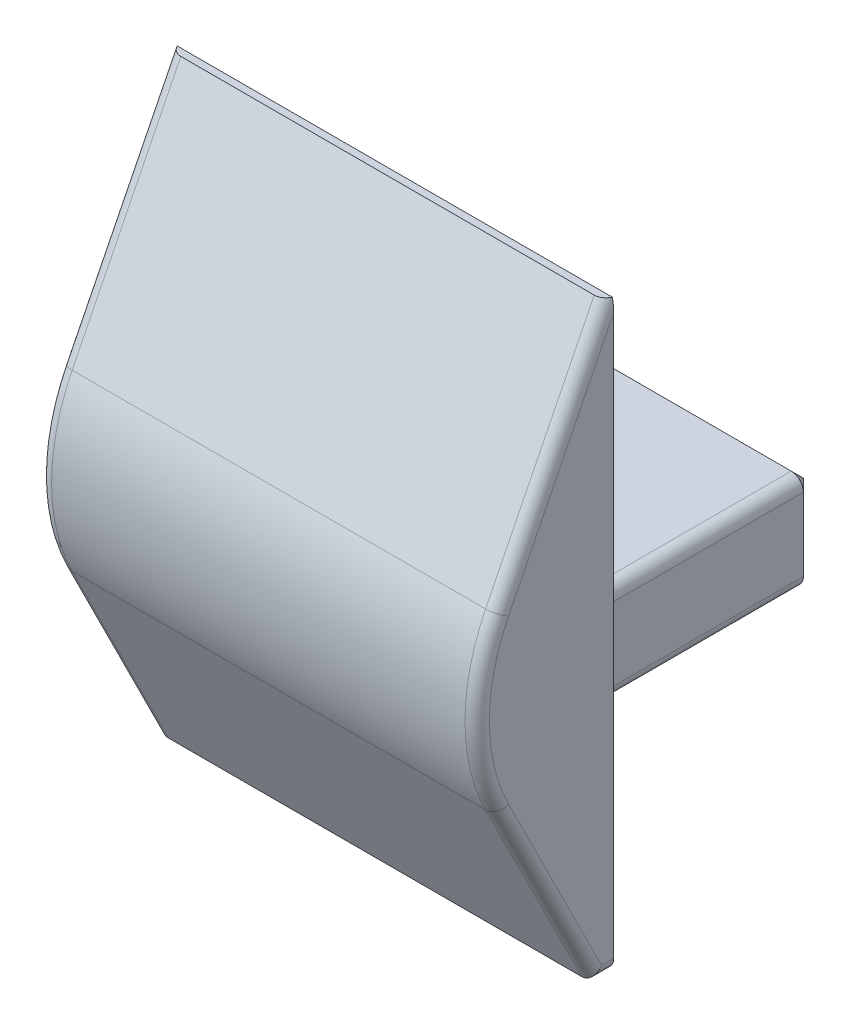
ISO-10303-21;
HEADER;
FILE_DESCRIPTION(('STEP AP214'),'2;1');
FILE_NAME('part.step','',(''),(''),'','','');
FILE_SCHEMA(('AUTOMOTIVE_DESIGN { 1 0 10303 214 1 1 1 1 }'));
ENDSEC;
DATA;
#1=APPLICATION_CONTEXT('core data for automotive mechanical design processes');
#2=APPLICATION_PROTOCOL_DEFINITION('international standard','automotive_design',2000,#1);
#3=PRODUCT_CONTEXT('',#1,'mechanical');
#4=PRODUCT('Part','Part','',(#3));
#5=PRODUCT_RELATED_PRODUCT_CATEGORY('part','',(#4));
#6=PRODUCT_DEFINITION_FORMATION('','',#4);
#7=PRODUCT_DEFINITION_CONTEXT('part definition',#1,'design');
#8=PRODUCT_DEFINITION('design','',#6,#7);
#9=PRODUCT_DEFINITION_SHAPE('','',#8);
#10=(LENGTH_UNIT() NAMED_UNIT(*) SI_UNIT(.MILLI.,.METRE.));
#11=(NAMED_UNIT(*) PLANE_ANGLE_UNIT() SI_UNIT($,.RADIAN.));
#12=(NAMED_UNIT(*) SI_UNIT($,.STERADIAN.) SOLID_ANGLE_UNIT());
#13=UNCERTAINTY_MEASURE_WITH_UNIT(LENGTH_MEASURE(1.E-05),#10,'distance_accuracy_value','');
#14=(GEOMETRIC_REPRESENTATION_CONTEXT(3) GLOBAL_UNCERTAINTY_ASSIGNED_CONTEXT((#13)) GLOBAL_UNIT_ASSIGNED_CONTEXT((#10,
#11,#12)) REPRESENTATION_CONTEXT('',''));
#15=CARTESIAN_POINT('',(0.,0.,0.));
#16=DIRECTION('',(0.,0.,1.));
#17=DIRECTION('',(1.,0.,0.));
#18=AXIS2_PLACEMENT_3D('',#15,#16,#17);
#19=CARTESIAN_POINT('',(60.6049457563615,0.,28.7935567964383));
#20=DIRECTION('',(0.,0.,1.));
#21=DIRECTION('',(0.,-1.,0.));
#22=AXIS2_PLACEMENT_3D('',#19,#20,#21);
#23=PLANE('',#22);
#24=DIRECTION('',(-1.,0.,0.));
#25=VECTOR('',#24,1.);
#26=CARTESIAN_POINT('',(60.6049457563615,-853.619201363697,28.7935567964377));
#27=LINE('',#26,#25);
#28=CARTESIAN_POINT('',(34.8831606908635,-853.619201363697,28.7935567964377));
#29=VERTEX_POINT('',#28);
#30=CARTESIAN_POINT('',(16.996982024228,-853.619201363697,28.7935567964377));
#31=VERTEX_POINT('',#30);
#32=EDGE_CURVE('E378',#29,#31,#27,.T.);
#33=ORIENTED_EDGE('',*,*,#32,.F.);
#34=CARTESIAN_POINT('',(34.4400713575457,-854.137235352447,28.7935567964377));
#35=DIRECTION('',(0.,0.,1.));
#36=DIRECTION('',(0.,1.,0.));
#37=AXIS2_PLACEMENT_3D('',#34,#35,#36);
#38=ELLIPSE('',#37,1.1180339887498,0.5);
#39=CARTESIAN_POINT('',(34.9400713575457,-854.137235352447,28.7935567964377));
#40=VERTEX_POINT('',#39);
#41=EDGE_CURVE('E213',#29,#40,#38,.F.);
#42=ORIENTED_EDGE('',*,*,#41,.T.);
#43=DIRECTION('',(0.,1.,0.));
#44=VECTOR('',#43,1.);
#45=CARTESIAN_POINT('',(34.9400713575457,0.,28.7935567964383));
#46=LINE('',#45,#44);
#47=CARTESIAN_POINT('',(34.9400713575457,-877.136577571572,28.7935567964377));
#48=VERTEX_POINT('',#47);
#49=EDGE_CURVE('E197',#48,#40,#46,.T.);
#50=ORIENTED_EDGE('',*,*,#49,.F.);
#51=CARTESIAN_POINT('',(34.4400713575457,-877.136577571572,28.7935567964377));
#52=DIRECTION('',(0.,0.,1.));
#53=DIRECTION('',(0.,-1.,0.));
#54=AXIS2_PLACEMENT_3D('',#51,#52,#53);
#55=CIRCLE('',#54,0.5);
#56=CARTESIAN_POINT('',(34.4400713575457,-877.636577571572,28.7935567964377));
#57=VERTEX_POINT('',#56);
#58=EDGE_CURVE('E210',#48,#57,#55,.F.);
#59=ORIENTED_EDGE('',*,*,#58,.T.);
#60=DIRECTION('',(-1.,0.,0.));
#61=VECTOR('',#60,1.);
#62=CARTESIAN_POINT('',(60.6049457563615,-877.636577571572,28.7935567964377));
#63=LINE('',#62,#61);
#64=CARTESIAN_POINT('',(17.4400713575457,-877.636577571572,28.7935567964377));
#65=VERTEX_POINT('',#64);
#66=EDGE_CURVE('E376',#57,#65,#63,.T.);
#67=ORIENTED_EDGE('',*,*,#66,.T.);
#68=CARTESIAN_POINT('',(17.4400713575457,-877.136577571572,28.7935567964377));
#69=DIRECTION('',(0.,0.,1.));
#70=DIRECTION('',(0.,-1.,0.));
#71=AXIS2_PLACEMENT_3D('',#68,#69,#70);
#72=CIRCLE('',#71,0.5);
#73=CARTESIAN_POINT('',(16.9400713575457,-877.136577571572,28.7935567964377));
#74=VERTEX_POINT('',#73);
#75=EDGE_CURVE('E219',#65,#74,#72,.F.);
#76=ORIENTED_EDGE('',*,*,#75,.T.);
#77=DIRECTION('',(0.,-1.,0.));
#78=VECTOR('',#77,1.);
#79=CARTESIAN_POINT('',(16.9400713575457,0.,28.7935567964383));
#80=LINE('',#79,#78);
#81=CARTESIAN_POINT('',(16.9400713575457,-854.137235352447,28.7935567964377));
#82=VERTEX_POINT('',#81);
#83=EDGE_CURVE('E366',#82,#74,#80,.T.);
#84=ORIENTED_EDGE('',*,*,#83,.F.);
#85=CARTESIAN_POINT('',(17.4400713575457,-854.137235352447,28.7935567964377));
#86=DIRECTION('',(0.,0.,1.));
#87=DIRECTION('',(0.,1.,0.));
#88=AXIS2_PLACEMENT_3D('',#85,#86,#87);
#89=ELLIPSE('',#88,1.1180339887498,0.5);
#90=EDGE_CURVE('E222',#82,#31,#89,.F.);
#91=ORIENTED_EDGE('',*,*,#90,.T.);
#92=EDGE_LOOP('',(#33,#42,#50,#59,#67,#76,#84,#91));
#93=FACE_BOUND('',#92,.T.);
#94=DIRECTION('',(0.,-1.,0.));
#95=VECTOR('',#94,1.);
#96=CARTESIAN_POINT('',(34.7400713575457,0.,28.7935567964383));
#97=LINE('',#96,#95);
#98=CARTESIAN_POINT('',(34.7400713575457,-864.636577571572,28.7935567964377));
#99=VERTEX_POINT('',#98);
#100=CARTESIAN_POINT('',(34.7400713575457,-867.636577571572,28.7935567964377));
#101=VERTEX_POINT('',#100);
#102=EDGE_CURVE('E360',#99,#101,#97,.T.);
#103=ORIENTED_EDGE('',*,*,#102,.F.);
#104=CARTESIAN_POINT('',(34.2400713575457,-864.636577571572,28.7935567964377));
#105=DIRECTION('',(0.,0.,1.));
#106=DIRECTION('',(0.,-1.,0.));
#107=AXIS2_PLACEMENT_3D('',#104,#105,#106);
#108=CIRCLE('',#107,0.5);
#109=CARTESIAN_POINT('',(34.2400713575457,-864.136577571572,28.7935567964377));
#110=VERTEX_POINT('',#109);
#111=EDGE_CURVE('E275',#99,#110,#108,.T.);
#112=ORIENTED_EDGE('',*,*,#111,.T.);
#113=DIRECTION('',(-1.,0.,0.));
#114=VECTOR('',#113,1.);
#115=CARTESIAN_POINT('',(44.2342184715733,-864.136577571572,28.7935567964377));
#116=LINE('',#115,#114);
#117=CARTESIAN_POINT('',(17.6400713575457,-864.136577571572,28.7935567964377));
#118=VERTEX_POINT('',#117);
#119=EDGE_CURVE('E357',#110,#118,#116,.T.);
#120=ORIENTED_EDGE('',*,*,#119,.T.);
#121=CARTESIAN_POINT('',(17.6400713575457,-864.636577571572,28.7935567964377));
#122=DIRECTION('',(0.,0.,1.));
#123=DIRECTION('',(0.,-1.,0.));
#124=AXIS2_PLACEMENT_3D('',#121,#122,#123);
#125=CIRCLE('',#124,0.5);
#126=CARTESIAN_POINT('',(17.1400713575457,-864.636577571572,28.7935567964377));
#127=VERTEX_POINT('',#126);
#128=EDGE_CURVE('E271',#118,#127,#125,.T.);
#129=ORIENTED_EDGE('',*,*,#128,.T.);
#130=DIRECTION('',(0.,-1.,0.));
#131=VECTOR('',#130,1.);
#132=CARTESIAN_POINT('',(17.1400713575457,0.,28.7935567964383));
#133=LINE('',#132,#131);
#134=CARTESIAN_POINT('',(17.1400713575457,-867.636577571572,28.7935567964377));
#135=VERTEX_POINT('',#134);
#136=EDGE_CURVE('E286',#127,#135,#133,.T.);
#137=ORIENTED_EDGE('',*,*,#136,.T.);
#138=CARTESIAN_POINT('',(17.6400713575457,-867.636577571572,28.7935567964377));
#139=DIRECTION('',(0.,0.,1.));
#140=DIRECTION('',(0.,-1.,0.));
#141=AXIS2_PLACEMENT_3D('',#138,#139,#140);
#142=CIRCLE('',#141,0.5);
#143=CARTESIAN_POINT('',(17.6400713575457,-868.136577571572,28.7935567964377));
#144=VERTEX_POINT('',#143);
#145=EDGE_CURVE('E269',#135,#144,#142,.T.);
#146=ORIENTED_EDGE('',*,*,#145,.T.);
#147=DIRECTION('',(-1.,0.,0.));
#148=VECTOR('',#147,1.);
#149=CARTESIAN_POINT('',(44.2342184715733,-868.136577571572,28.7935567964377));
#150=LINE('',#149,#148);
#151=CARTESIAN_POINT('',(34.2400713575457,-868.136577571572,28.7935567964377));
#152=VERTEX_POINT('',#151);
#153=EDGE_CURVE('E355',#152,#144,#150,.T.);
#154=ORIENTED_EDGE('',*,*,#153,.F.);
#155=CARTESIAN_POINT('',(34.2400713575457,-867.636577571572,28.7935567964377));
#156=DIRECTION('',(0.,0.,1.));
#157=DIRECTION('',(0.,-1.,0.));
#158=AXIS2_PLACEMENT_3D('',#155,#156,#157);
#159=CIRCLE('',#158,0.5);
#160=EDGE_CURVE('E273',#152,#101,#159,.T.);
#161=ORIENTED_EDGE('',*,*,#160,.T.);
#162=EDGE_LOOP('',(#103,#112,#120,#129,#137,#146,#154,#161));
#163=FACE_BOUND('',#162,.T.);
#164=ADVANCED_FACE('F47',(#93,#163),#23,.F.);
#165=CARTESIAN_POINT('',(60.6049457563615,-866.136577571572,26.4079729903764));
#166=DIRECTION('',(-1.,0.,0.));
#167=DIRECTION('',(0.,0.,1.));
#168=AXIS2_PLACEMENT_3D('',#165,#166,#167);
#169=CYLINDRICAL_SURFACE('',#168,8.00000000000002);
#170=DIRECTION('',(-1.,0.,0.));
#171=VECTOR('',#170,1.);
#172=CARTESIAN_POINT('',(60.6049457563615,-869.714286335572,33.5633905183756));
#173=LINE('',#172,#171);
#174=CARTESIAN_POINT('',(34.4400713575457,-869.714286335572,33.5633905183756));
#175=VERTEX_POINT('',#174);
#176=CARTESIAN_POINT('',(17.4400713575457,-869.714286335572,33.5633905183756));
#177=VERTEX_POINT('',#176);
#178=EDGE_CURVE('E370',#175,#177,#173,.T.);
#179=ORIENTED_EDGE('',*,*,#178,.F.);
#180=CARTESIAN_POINT('',(34.4400713575457,-866.136577571572,26.4079729903764));
#181=DIRECTION('',(1.,0.,0.));
#182=DIRECTION('',(0.,0.,-1.));
#183=AXIS2_PLACEMENT_3D('',#180,#181,#182);
#184=CIRCLE('',#183,8.00000000000002);
#185=CARTESIAN_POINT('',(34.4400713575457,-862.558868807572,33.5633905183756));
#186=VERTEX_POINT('',#185);
#187=EDGE_CURVE('E232',#175,#186,#184,.F.);
#188=ORIENTED_EDGE('',*,*,#187,.T.);
#189=DIRECTION('',(-1.,0.,0.));
#190=VECTOR('',#189,1.);
#191=CARTESIAN_POINT('',(60.6049457563615,-862.558868807572,33.5633905183756));
#192=LINE('',#191,#190);
#193=CARTESIAN_POINT('',(17.4400713575457,-862.558868807572,33.5633905183756));
#194=VERTEX_POINT('',#193);
#195=EDGE_CURVE('E368',#186,#194,#192,.T.);
#196=ORIENTED_EDGE('',*,*,#195,.T.);
#197=CARTESIAN_POINT('',(17.4400713575457,-866.136577571572,26.4079729903764));
#198=DIRECTION('',(1.,0.,0.));
#199=DIRECTION('',(0.,0.,-1.));
#200=AXIS2_PLACEMENT_3D('',#197,#198,#199);
#201=CIRCLE('',#200,8.00000000000002);
#202=EDGE_CURVE('E230',#194,#177,#201,.T.);
#203=ORIENTED_EDGE('',*,*,#202,.T.);
#204=EDGE_LOOP('',(#179,#188,#196,#203));
#205=FACE_BOUND('',#204,.T.);
#206=ADVANCED_FACE('F416',(#205),#169,.T.);
#207=CARTESIAN_POINT('',(60.6049457563615,-187.368213474495,374.73642694895));
#208=DIRECTION('',(0.,-0.447213595499996,0.894427190999897));
#209=DIRECTION('',(0.,-0.894427190999897,-0.447213595499996));
#210=AXIS2_PLACEMENT_3D('',#207,#208,#209);
#211=PLANE('',#210);
#212=DIRECTION('',(-1.,0.,0.));
#213=VECTOR('',#212,1.);
#214=CARTESIAN_POINT('',(60.6049457563615,-877.636577571572,29.6022449003753));
#215=LINE('',#214,#213);
#216=CARTESIAN_POINT('',(34.4400713575457,-877.636577571572,29.6022449003753));
#217=VERTEX_POINT('',#216);
#218=CARTESIAN_POINT('',(17.4400713575457,-877.636577571572,29.6022449003753));
#219=VERTEX_POINT('',#218);
#220=EDGE_CURVE('E373',#217,#219,#215,.T.);
#221=ORIENTED_EDGE('',*,*,#220,.F.);
#222=DIRECTION('',(0.,0.894427190999897,0.447213595499996));
#223=VECTOR('',#222,1.);
#224=CARTESIAN_POINT('',(34.4400713575457,-187.368213474495,374.73642694895));
#225=LINE('',#224,#223);
#226=EDGE_CURVE('E237',#217,#175,#225,.T.);
#227=ORIENTED_EDGE('',*,*,#226,.T.);
#228=ORIENTED_EDGE('',*,*,#178,.T.);
#229=DIRECTION('',(0.,-0.894427190999897,-0.447213595499996));
#230=VECTOR('',#229,1.);
#231=CARTESIAN_POINT('',(17.4400713575457,-877.636577571572,29.6022449003752));
#232=LINE('',#231,#230);
#233=EDGE_CURVE('E234',#177,#219,#232,.T.);
#234=ORIENTED_EDGE('',*,*,#233,.T.);
#235=EDGE_LOOP('',(#221,#227,#228,#234));
#236=FACE_BOUND('',#235,.T.);
#237=ADVANCED_FACE('F420',(#236),#211,.T.);
#238=CARTESIAN_POINT('',(60.6049457563615,-877.636577571572,0.));
#239=DIRECTION('',(0.,-1.,0.));
#240=DIRECTION('',(0.,0.,-1.));
#241=AXIS2_PLACEMENT_3D('',#238,#239,#240);
#242=PLANE('',#241);
#243=ORIENTED_EDGE('',*,*,#220,.T.);
#244=DIRECTION('',(0.,0.,-1.));
#245=VECTOR('',#244,1.);
#246=CARTESIAN_POINT('',(17.4400713575457,-877.636577571572,28.7935567964377));
#247=LINE('',#246,#245);
#248=EDGE_CURVE('E248',#219,#65,#247,.T.);
#249=ORIENTED_EDGE('',*,*,#248,.T.);
#250=ORIENTED_EDGE('',*,*,#66,.F.);
#251=DIRECTION('',(0.,0.,1.));
#252=VECTOR('',#251,1.);
#253=CARTESIAN_POINT('',(34.4400713575457,-877.636577571572,0.));
#254=LINE('',#253,#252);
#255=EDGE_CURVE('E218',#57,#217,#254,.T.);
#256=ORIENTED_EDGE('',*,*,#255,.T.);
#257=EDGE_LOOP('',(#243,#249,#250,#256));
#258=FACE_BOUND('',#257,.T.);
#259=ADVANCED_FACE('F463',(#258),#242,.T.);
#260=CARTESIAN_POINT('',(60.6049457563615,-853.619201363707,3.15902563872048E-10));
#261=DIRECTION('',(0.,1.,-3.70074341541725E-13));
#262=DIRECTION('',(0.,3.70074341541725E-13,1.));
#263=AXIS2_PLACEMENT_3D('',#260,#261,#262);
#264=PLANE('',#263);
#265=DIRECTION('',(-1.,0.,0.));
#266=VECTOR('',#265,1.);
#267=CARTESIAN_POINT('',(60.6049457563615,-853.619201363697,29.0935567964377));
#268=LINE('',#267,#266);
#269=CARTESIAN_POINT('',(34.4400713575457,-853.619201363697,29.0935567964377));
#270=VERTEX_POINT('',#269);
#271=CARTESIAN_POINT('',(17.4400713575457,-853.619201363697,29.0935567964377));
#272=VERTEX_POINT('',#271);
#273=EDGE_CURVE('E214',#270,#272,#268,.T.);
#274=ORIENTED_EDGE('',*,*,#273,.F.);
#275=CARTESIAN_POINT('',(34.4400713575457,-853.619201363697,28.5345398020628));
#276=DIRECTION('',(0.,1.,-3.70074341541725E-13));
#277=DIRECTION('',(0.,-3.70074341541725E-13,-1.));
#278=AXIS2_PLACEMENT_3D('',#275,#276,#277);
#279=ELLIPSE('',#278,0.559016994374856,0.5);
#280=EDGE_CURVE('E220',#270,#29,#279,.T.);
#281=ORIENTED_EDGE('',*,*,#280,.T.);
#282=ORIENTED_EDGE('',*,*,#32,.T.);
#283=CARTESIAN_POINT('',(17.4400713575457,-853.619201363697,28.5345398020628));
#284=DIRECTION('',(0.,1.,-3.70074341541725E-13));
#285=DIRECTION('',(0.,-3.70074341541725E-13,-1.));
#286=AXIS2_PLACEMENT_3D('',#283,#284,#285);
#287=ELLIPSE('',#286,0.559016994374856,0.5);
#288=EDGE_CURVE('E224',#31,#272,#287,.T.);
#289=ORIENTED_EDGE('',*,*,#288,.T.);
#290=EDGE_LOOP('',(#274,#281,#282,#289));
#291=FACE_BOUND('',#290,.T.);
#292=ADVANCED_FACE('F396',(#291),#264,.T.);
#293=CARTESIAN_POINT('',(60.6049457563615,-159.086417554192,-318.172835108351));
#294=DIRECTION('',(0.,-0.447213595499995,-0.894427190999897));
#295=DIRECTION('',(0.,0.894427190999897,-0.447213595499995));
#296=AXIS2_PLACEMENT_3D('',#293,#294,#295);
#297=PLANE('',#296);
#298=ORIENTED_EDGE('',*,*,#195,.F.);
#299=DIRECTION('',(0.,-0.894427190999897,0.447213595499995));
#300=VECTOR('',#299,1.);
#301=CARTESIAN_POINT('',(34.4400713575457,-853.619201363697,29.0935567964376));
#302=LINE('',#301,#300);
#303=EDGE_CURVE('E392',#186,#270,#302,.F.);
#304=ORIENTED_EDGE('',*,*,#303,.T.);
#305=ORIENTED_EDGE('',*,*,#273,.T.);
#306=DIRECTION('',(0.,0.894427190999897,-0.447213595499995));
#307=VECTOR('',#306,1.);
#308=CARTESIAN_POINT('',(17.4400713575457,-159.086417554192,-318.172835108351));
#309=LINE('',#308,#307);
#310=EDGE_CURVE('E390',#272,#194,#309,.F.);
#311=ORIENTED_EDGE('',*,*,#310,.T.);
#312=EDGE_LOOP('',(#298,#304,#305,#311));
#313=FACE_BOUND('',#312,.T.);
#314=ADVANCED_FACE('F403',(#313),#297,.F.);
#315=CARTESIAN_POINT('',(34.9400713575457,-877.936577571572,22.7935567964381));
#316=DIRECTION('',(1.,0.,0.));
#317=DIRECTION('',(0.,0.,-1.));
#318=AXIS2_PLACEMENT_3D('',#315,#316,#317);
#319=PLANE('',#318);
#320=ORIENTED_EDGE('',*,*,#49,.T.);
#321=DIRECTION('',(0.,-0.894427190999897,0.447213595499995));
#322=VECTOR('',#321,1.);
#323=CARTESIAN_POINT('',(34.9400713575457,-862.782475605322,33.1161769228756));
#324=LINE('',#323,#322);
#325=CARTESIAN_POINT('',(34.9400713575457,-862.782475605322,33.1161769228757));
#326=VERTEX_POINT('',#325);
#327=EDGE_CURVE('E388',#40,#326,#324,.T.);
#328=ORIENTED_EDGE('',*,*,#327,.T.);
#329=CARTESIAN_POINT('',(34.9400713575457,-866.136577571572,26.4079729903764));
#330=DIRECTION('',(1.,0.,0.));
#331=DIRECTION('',(0.,0.,-1.));
#332=AXIS2_PLACEMENT_3D('',#329,#330,#331);
#333=CIRCLE('',#332,7.50000000000002);
#334=CARTESIAN_POINT('',(34.9400713575457,-869.490679537822,33.1161769228757));
#335=VERTEX_POINT('',#334);
#336=EDGE_CURVE('E386',#326,#335,#333,.T.);
#337=ORIENTED_EDGE('',*,*,#336,.T.);
#338=DIRECTION('',(0.,0.894427190999897,0.447213595499996));
#339=VECTOR('',#338,1.);
#340=CARTESIAN_POINT('',(34.9400713575457,-880.376446015397,27.6732936840877));
#341=LINE('',#340,#339);
#342=CARTESIAN_POINT('',(34.9400713575457,-877.136577571572,29.2932279060004));
#343=VERTEX_POINT('',#342);
#344=EDGE_CURVE('E200',#335,#343,#341,.F.);
#345=ORIENTED_EDGE('',*,*,#344,.T.);
#346=DIRECTION('',(0.,0.,1.));
#347=VECTOR('',#346,1.);
#348=CARTESIAN_POINT('',(34.9400713575457,-877.136577571572,22.7935567964381));
#349=LINE('',#348,#347);
#350=EDGE_CURVE('E193',#343,#48,#349,.F.);
#351=ORIENTED_EDGE('',*,*,#350,.T.);
#352=EDGE_LOOP('',(#320,#328,#337,#345,#351));
#353=FACE_BOUND('',#352,.T.);
#354=ADVANCED_FACE('F195',(#353),#319,.T.);
#355=CARTESIAN_POINT('',(16.9400713575457,-877.936577571572,22.7935567964381));
#356=DIRECTION('',(1.,0.,0.));
#357=DIRECTION('',(0.,0.,-1.));
#358=AXIS2_PLACEMENT_3D('',#355,#356,#357);
#359=PLANE('',#358);
#360=CARTESIAN_POINT('',(16.9400713575457,-866.136577571572,26.4079729903764));
#361=DIRECTION('',(1.,0.,0.));
#362=DIRECTION('',(0.,0.,-1.));
#363=AXIS2_PLACEMENT_3D('',#360,#361,#362);
#364=CIRCLE('',#363,7.50000000000002);
#365=CARTESIAN_POINT('',(16.9400713575457,-869.490679537822,33.1161769228757));
#366=VERTEX_POINT('',#365);
#367=CARTESIAN_POINT('',(16.9400713575457,-862.782475605322,33.1161769228757));
#368=VERTEX_POINT('',#367);
#369=EDGE_CURVE('E243',#366,#368,#364,.F.);
#370=ORIENTED_EDGE('',*,*,#369,.T.);
#371=DIRECTION('',(0.,0.894427190999897,-0.447213595499995));
#372=VECTOR('',#371,1.);
#373=CARTESIAN_POINT('',(16.9400713575457,-870.776709127746,37.1132936840881));
#374=LINE('',#373,#372);
#375=EDGE_CURVE('E245',#368,#82,#374,.T.);
#376=ORIENTED_EDGE('',*,*,#375,.T.);
#377=ORIENTED_EDGE('',*,*,#83,.T.);
#378=DIRECTION('',(0.,0.,-1.));
#379=VECTOR('',#378,1.);
#380=CARTESIAN_POINT('',(16.9400713575457,-877.136577571572,29.6022449003753));
#381=LINE('',#380,#379);
#382=CARTESIAN_POINT('',(16.9400713575457,-877.136577571572,29.2932279060003));
#383=VERTEX_POINT('',#382);
#384=EDGE_CURVE('E239',#74,#383,#381,.F.);
#385=ORIENTED_EDGE('',*,*,#384,.T.);
#386=DIRECTION('',(0.,-0.894427190999897,-0.447213595499996));
#387=VECTOR('',#386,1.);
#388=CARTESIAN_POINT('',(16.9400713575457,-869.490679537822,33.1161769228756));
#389=LINE('',#388,#387);
#390=EDGE_CURVE('E241',#383,#366,#389,.F.);
#391=ORIENTED_EDGE('',*,*,#390,.T.);
#392=EDGE_LOOP('',(#370,#376,#377,#385,#391));
#393=FACE_BOUND('',#392,.T.);
#394=ADVANCED_FACE('F435',(#393),#359,.F.);
#395=CARTESIAN_POINT('',(44.2342184715733,-868.136577571572,0.));
#396=DIRECTION('',(0.,1.,0.));
#397=DIRECTION('',(0.,0.,1.));
#398=AXIS2_PLACEMENT_3D('',#395,#396,#397);
#399=PLANE('',#398);
#400=DIRECTION('',(0.,0.,1.));
#401=VECTOR('',#400,1.);
#402=CARTESIAN_POINT('',(17.6400713575457,-868.136577571572,0.));
#403=LINE('',#402,#401);
#404=CARTESIAN_POINT('',(17.6400713575457,-868.136577571572,20.7935567964381));
#405=VERTEX_POINT('',#404);
#406=EDGE_CURVE('E256',#144,#405,#403,.F.);
#407=ORIENTED_EDGE('',*,*,#406,.T.);
#408=DIRECTION('',(1.,0.,0.));
#409=VECTOR('',#408,1.);
#410=CARTESIAN_POINT('',(44.2342184715733,-868.136577571572,20.7935567964381));
#411=LINE('',#410,#409);
#412=CARTESIAN_POINT('',(34.2400713575457,-868.136577571572,20.7935567964381));
#413=VERTEX_POINT('',#412);
#414=EDGE_CURVE('E311',#405,#413,#411,.T.);
#415=ORIENTED_EDGE('',*,*,#414,.T.);
#416=DIRECTION('',(0.,0.,1.));
#417=VECTOR('',#416,1.);
#418=CARTESIAN_POINT('',(34.2400713575457,-868.136577571572,0.));
#419=LINE('',#418,#417);
#420=EDGE_CURVE('E254',#413,#152,#419,.T.);
#421=ORIENTED_EDGE('',*,*,#420,.T.);
#422=ORIENTED_EDGE('',*,*,#153,.T.);
#423=EDGE_LOOP('',(#407,#415,#421,#422));
#424=FACE_BOUND('',#423,.T.);
#425=ADVANCED_FACE('F352',(#424),#399,.F.);
#426=CARTESIAN_POINT('',(44.2342184715733,-864.136577571572,0.));
#427=DIRECTION('',(0.,1.,0.));
#428=DIRECTION('',(0.,0.,1.));
#429=AXIS2_PLACEMENT_3D('',#426,#427,#428);
#430=PLANE('',#429);
#431=DIRECTION('',(0.,0.,1.));
#432=VECTOR('',#431,1.);
#433=CARTESIAN_POINT('',(34.2400713575457,-864.136577571572,20.2935567964381));
#434=LINE('',#433,#432);
#435=CARTESIAN_POINT('',(34.2400713575457,-864.136577571572,20.7935567964381));
#436=VERTEX_POINT('',#435);
#437=EDGE_CURVE('E259',#110,#436,#434,.F.);
#438=ORIENTED_EDGE('',*,*,#437,.T.);
#439=DIRECTION('',(-1.,0.,0.));
#440=VECTOR('',#439,1.);
#441=CARTESIAN_POINT('',(17.6400713575457,-864.136577571572,20.7935567964381));
#442=LINE('',#441,#440);
#443=CARTESIAN_POINT('',(17.6400713575457,-864.136577571572,20.7935567964381));
#444=VERTEX_POINT('',#443);
#445=EDGE_CURVE('E309',#436,#444,#442,.T.);
#446=ORIENTED_EDGE('',*,*,#445,.T.);
#447=DIRECTION('',(0.,0.,1.));
#448=VECTOR('',#447,1.);
#449=CARTESIAN_POINT('',(17.6400713575457,-864.136577571572,28.7935567964377));
#450=LINE('',#449,#448);
#451=EDGE_CURVE('E262',#444,#118,#450,.T.);
#452=ORIENTED_EDGE('',*,*,#451,.T.);
#453=ORIENTED_EDGE('',*,*,#119,.F.);
#454=EDGE_LOOP('',(#438,#446,#452,#453));
#455=FACE_BOUND('',#454,.T.);
#456=ADVANCED_FACE('F492',(#455),#430,.T.);
#457=CARTESIAN_POINT('',(44.2342184715733,0.,20.2935567964381));
#458=DIRECTION('',(0.,0.,1.));
#459=DIRECTION('',(1.,0.,0.));
#460=AXIS2_PLACEMENT_3D('',#457,#458,#459);
#461=PLANE('',#460);
#462=DIRECTION('',(1.,0.,0.));
#463=VECTOR('',#462,1.);
#464=CARTESIAN_POINT('',(34.2400713575457,-864.636577571572,20.2935567964381));
#465=LINE('',#464,#463);
#466=CARTESIAN_POINT('',(17.6400713575457,-864.636577571572,20.2935567964381));
#467=VERTEX_POINT('',#466);
#468=CARTESIAN_POINT('',(34.2400713575457,-864.636577571572,20.2935567964381));
#469=VERTEX_POINT('',#468);
#470=EDGE_CURVE('E297',#467,#469,#465,.T.);
#471=ORIENTED_EDGE('',*,*,#470,.T.);
#472=DIRECTION('',(0.,-1.,0.));
#473=VECTOR('',#472,1.);
#474=CARTESIAN_POINT('',(34.2400713575457,0.,20.2935567964381));
#475=LINE('',#474,#473);
#476=CARTESIAN_POINT('',(34.2400713575457,-867.636577571572,20.2935567964381));
#477=VERTEX_POINT('',#476);
#478=EDGE_CURVE('E299',#469,#477,#475,.T.);
#479=ORIENTED_EDGE('',*,*,#478,.T.);
#480=DIRECTION('',(-1.,0.,0.));
#481=VECTOR('',#480,1.);
#482=CARTESIAN_POINT('',(44.2342184715733,-867.636577571572,20.2935567964381));
#483=LINE('',#482,#481);
#484=CARTESIAN_POINT('',(17.6400713575457,-867.636577571572,20.2935567964381));
#485=VERTEX_POINT('',#484);
#486=EDGE_CURVE('E295',#477,#485,#483,.T.);
#487=ORIENTED_EDGE('',*,*,#486,.T.);
#488=DIRECTION('',(0.,1.,0.));
#489=VECTOR('',#488,1.);
#490=CARTESIAN_POINT('',(17.6400713575457,0.,20.2935567964381));
#491=LINE('',#490,#489);
#492=EDGE_CURVE('E277',#485,#467,#491,.T.);
#493=ORIENTED_EDGE('',*,*,#492,.T.);
#494=EDGE_LOOP('',(#471,#479,#487,#493));
#495=FACE_BOUND('',#494,.T.);
#496=ADVANCED_FACE('F487',(#495),#461,.F.);
#497=CARTESIAN_POINT('',(34.7400713575457,-657.836577571572,0.));
#498=DIRECTION('',(-1.,0.,0.));
#499=DIRECTION('',(0.,0.,1.));
#500=AXIS2_PLACEMENT_3D('',#497,#498,#499);
#501=PLANE('',#500);
#502=DIRECTION('',(0.,0.,1.));
#503=VECTOR('',#502,1.);
#504=CARTESIAN_POINT('',(34.7400713575457,-867.636577571572,0.));
#505=LINE('',#504,#503);
#506=CARTESIAN_POINT('',(34.7400713575457,-867.636577571572,20.7935567964381));
#507=VERTEX_POINT('',#506);
#508=EDGE_CURVE('E266',#101,#507,#505,.F.);
#509=ORIENTED_EDGE('',*,*,#508,.T.);
#510=DIRECTION('',(0.,1.,0.));
#511=VECTOR('',#510,1.);
#512=CARTESIAN_POINT('',(34.7400713575457,-657.836577571572,20.7935567964381));
#513=LINE('',#512,#511);
#514=CARTESIAN_POINT('',(34.7400713575457,-864.636577571572,20.7935567964381));
#515=VERTEX_POINT('',#514);
#516=EDGE_CURVE('E302',#507,#515,#513,.T.);
#517=ORIENTED_EDGE('',*,*,#516,.T.);
#518=DIRECTION('',(0.,0.,1.));
#519=VECTOR('',#518,1.);
#520=CARTESIAN_POINT('',(34.7400713575457,-864.636577571572,28.7935567964377));
#521=LINE('',#520,#519);
#522=EDGE_CURVE('E264',#515,#99,#521,.T.);
#523=ORIENTED_EDGE('',*,*,#522,.T.);
#524=ORIENTED_EDGE('',*,*,#102,.T.);
#525=EDGE_LOOP('',(#509,#517,#523,#524));
#526=FACE_BOUND('',#525,.T.);
#527=ADVANCED_FACE('F482',(#526),#501,.F.);
#528=CARTESIAN_POINT('',(17.1400713575457,-657.836577571572,0.));
#529=DIRECTION('',(1.,0.,0.));
#530=DIRECTION('',(0.,0.,-1.));
#531=AXIS2_PLACEMENT_3D('',#528,#529,#530);
#532=PLANE('',#531);
#533=DIRECTION('',(0.,0.,1.));
#534=VECTOR('',#533,1.);
#535=CARTESIAN_POINT('',(17.1400713575457,-864.636577571572,20.2935567964381));
#536=LINE('',#535,#534);
#537=CARTESIAN_POINT('',(17.1400713575457,-864.636577571572,20.7935567964381));
#538=VERTEX_POINT('',#537);
#539=EDGE_CURVE('E250',#127,#538,#536,.F.);
#540=ORIENTED_EDGE('',*,*,#539,.T.);
#541=DIRECTION('',(0.,-1.,0.));
#542=VECTOR('',#541,1.);
#543=CARTESIAN_POINT('',(17.1400713575457,-657.836577571572,20.7935567964381));
#544=LINE('',#543,#542);
#545=CARTESIAN_POINT('',(17.1400713575457,-867.636577571572,20.7935567964381));
#546=VERTEX_POINT('',#545);
#547=EDGE_CURVE('E12',#538,#546,#544,.T.);
#548=ORIENTED_EDGE('',*,*,#547,.T.);
#549=DIRECTION('',(0.,0.,1.));
#550=VECTOR('',#549,1.);
#551=CARTESIAN_POINT('',(17.1400713575457,-867.636577571572,0.));
#552=LINE('',#551,#550);
#553=EDGE_CURVE('E252',#546,#135,#552,.T.);
#554=ORIENTED_EDGE('',*,*,#553,.T.);
#555=ORIENTED_EDGE('',*,*,#136,.F.);
#556=EDGE_LOOP('',(#540,#548,#554,#555));
#557=FACE_BOUND('',#556,.T.);
#558=ADVANCED_FACE('F477',(#557),#532,.F.);
#559=CARTESIAN_POINT('',(34.4400713575457,-877.136577571572,0.));
#560=DIRECTION('',(0.,0.,1.));
#561=DIRECTION('',(1.,0.,0.));
#562=AXIS2_PLACEMENT_3D('',#559,#560,#561);
#563=CYLINDRICAL_SURFACE('',#562,0.5);
#564=ORIENTED_EDGE('',*,*,#58,.F.);
#565=ORIENTED_EDGE('',*,*,#350,.F.);
#566=CARTESIAN_POINT('',(34.4400713575457,-877.136577571572,29.2932279060002));
#567=DIRECTION('',(0.,0.525731112119116,0.850650808352051));
#568=DIRECTION('',(0.,-0.850650808352051,0.525731112119115));
#569=AXIS2_PLACEMENT_3D('',#566,#567,#568);
#570=ELLIPSE('',#569,0.587785252292465,0.5);
#571=EDGE_CURVE('E284',#217,#343,#570,.T.);
#572=ORIENTED_EDGE('',*,*,#571,.F.);
#573=ORIENTED_EDGE('',*,*,#255,.F.);
#574=EDGE_LOOP('',(#564,#565,#572,#573));
#575=FACE_BOUND('',#574,.T.);
#576=ADVANCED_FACE('F217',(#575),#563,.T.);
#577=CARTESIAN_POINT('',(34.4400713575457,-187.144606676745,374.28921335345));
#578=DIRECTION('',(0.,0.894427190999897,0.447213595499996));
#579=DIRECTION('',(0.,-0.447213595499996,0.894427190999897));
#580=AXIS2_PLACEMENT_3D('',#577,#578,#579);
#581=CYLINDRICAL_SURFACE('',#580,0.5);
#582=ORIENTED_EDGE('',*,*,#571,.T.);
#583=ORIENTED_EDGE('',*,*,#344,.F.);
#584=CARTESIAN_POINT('',(34.4400713575457,-869.490679537822,33.1161769228757));
#585=DIRECTION('',(0.,0.89442719099988,0.44721359550003));
#586=DIRECTION('',(0.,-0.44721359550003,0.89442719099988));
#587=AXIS2_PLACEMENT_3D('',#584,#585,#586);
#588=CIRCLE('',#587,0.5);
#589=EDGE_CURVE('E280',#175,#335,#588,.T.);
#590=ORIENTED_EDGE('',*,*,#589,.F.);
#591=ORIENTED_EDGE('',*,*,#226,.F.);
#592=EDGE_LOOP('',(#582,#583,#590,#591));
#593=FACE_BOUND('',#592,.T.);
#594=ADVANCED_FACE('F423',(#593),#581,.T.);
#595=CARTESIAN_POINT('',(34.4400713575457,-866.136577571572,26.4079729903764));
#596=DIRECTION('',(1.,0.,0.));
#597=DIRECTION('',(0.,0.,-1.));
#598=AXIS2_PLACEMENT_3D('',#595,#596,#597);
#599=TOROIDAL_SURFACE('',#598,7.50000000000002,0.5);
#600=ORIENTED_EDGE('',*,*,#589,.T.);
#601=ORIENTED_EDGE('',*,*,#336,.F.);
#602=CARTESIAN_POINT('',(34.4400713575457,-862.782475605322,33.1161769228756));
#603=DIRECTION('',(0.,0.89442719099988,-0.44721359550003));
#604=DIRECTION('',(0.,0.44721359550003,0.89442719099988));
#605=AXIS2_PLACEMENT_3D('',#602,#603,#604);
#606=CIRCLE('',#605,0.5);
#607=EDGE_CURVE('E278',#186,#326,#606,.T.);
#608=ORIENTED_EDGE('',*,*,#607,.F.);
#609=ORIENTED_EDGE('',*,*,#187,.F.);
#610=EDGE_LOOP('',(#600,#601,#608,#609));
#611=FACE_BOUND('',#610,.T.);
#612=ADVANCED_FACE('F428',(#611),#599,.T.);
#613=CARTESIAN_POINT('',(34.4400713575457,-870.776709127746,37.1132936840881));
#614=DIRECTION('',(0.,0.894427190999897,-0.447213595499995));
#615=DIRECTION('',(0.,0.447213595499995,0.894427190999897));
#616=AXIS2_PLACEMENT_3D('',#613,#614,#615);
#617=CYLINDRICAL_SURFACE('',#616,0.5);
#618=ORIENTED_EDGE('',*,*,#280,.F.);
#619=ORIENTED_EDGE('',*,*,#303,.F.);
#620=ORIENTED_EDGE('',*,*,#607,.T.);
#621=ORIENTED_EDGE('',*,*,#327,.F.);
#622=ORIENTED_EDGE('',*,*,#41,.F.);
#623=EDGE_LOOP('',(#618,#619,#620,#621,#622));
#624=FACE_BOUND('',#623,.T.);
#625=ADVANCED_FACE('F430',(#624),#617,.T.);
#626=CARTESIAN_POINT('',(17.4400713575457,-870.776709127746,37.1132936840881));
#627=DIRECTION('',(0.,0.894427190999897,-0.447213595499995));
#628=DIRECTION('',(0.,0.447213595499995,0.894427190999897));
#629=AXIS2_PLACEMENT_3D('',#626,#627,#628);
#630=CYLINDRICAL_SURFACE('',#629,0.5);
#631=ORIENTED_EDGE('',*,*,#90,.F.);
#632=ORIENTED_EDGE('',*,*,#375,.F.);
#633=CARTESIAN_POINT('',(17.4400713575457,-862.782475605322,33.1161769228756));
#634=DIRECTION('',(0.,-0.89442719099988,0.44721359550003));
#635=DIRECTION('',(0.,-0.44721359550003,-0.89442719099988));
#636=AXIS2_PLACEMENT_3D('',#633,#634,#635);
#637=CIRCLE('',#636,0.5);
#638=EDGE_CURVE('E281',#194,#368,#637,.T.);
#639=ORIENTED_EDGE('',*,*,#638,.F.);
#640=ORIENTED_EDGE('',*,*,#310,.F.);
#641=ORIENTED_EDGE('',*,*,#288,.F.);
#642=EDGE_LOOP('',(#631,#632,#639,#640,#641));
#643=FACE_BOUND('',#642,.T.);
#644=ADVANCED_FACE('F406',(#643),#630,.T.);
#645=CARTESIAN_POINT('',(17.4400713575457,-866.136577571572,26.4079729903764));
#646=DIRECTION('',(1.,0.,0.));
#647=DIRECTION('',(0.,0.,-1.));
#648=AXIS2_PLACEMENT_3D('',#645,#646,#647);
#649=TOROIDAL_SURFACE('',#648,7.50000000000002,0.5);
#650=ORIENTED_EDGE('',*,*,#638,.T.);
#651=ORIENTED_EDGE('',*,*,#369,.F.);
#652=CARTESIAN_POINT('',(17.4400713575457,-869.490679537822,33.1161769228756));
#653=DIRECTION('',(0.,-0.894427190999877,-0.447213595500036));
#654=DIRECTION('',(0.,0.447213595500036,-0.894427190999877));
#655=AXIS2_PLACEMENT_3D('',#652,#653,#654);
#656=CIRCLE('',#655,0.5);
#657=EDGE_CURVE('E289',#177,#366,#656,.T.);
#658=ORIENTED_EDGE('',*,*,#657,.F.);
#659=ORIENTED_EDGE('',*,*,#202,.F.);
#660=EDGE_LOOP('',(#650,#651,#658,#659));
#661=FACE_BOUND('',#660,.T.);
#662=ADVANCED_FACE('F412',(#661),#649,.T.);
#663=CARTESIAN_POINT('',(17.4400713575457,-877.136577571572,0.));
#664=DIRECTION('',(0.,0.,1.));
#665=DIRECTION('',(1.,0.,0.));
#666=AXIS2_PLACEMENT_3D('',#663,#664,#665);
#667=CYLINDRICAL_SURFACE('',#666,0.5);
#668=ORIENTED_EDGE('',*,*,#75,.F.);
#669=ORIENTED_EDGE('',*,*,#248,.F.);
#670=CARTESIAN_POINT('',(17.4400713575457,-877.136577571572,29.2932279060002));
#671=DIRECTION('',(0.,0.525731112119116,0.850650808352051));
#672=DIRECTION('',(0.,-0.850650808352051,0.525731112119115));
#673=AXIS2_PLACEMENT_3D('',#670,#671,#672);
#674=ELLIPSE('',#673,0.587785252292465,0.5);
#675=EDGE_CURVE('E287',#383,#219,#674,.T.);
#676=ORIENTED_EDGE('',*,*,#675,.F.);
#677=ORIENTED_EDGE('',*,*,#384,.F.);
#678=EDGE_LOOP('',(#668,#669,#676,#677));
#679=FACE_BOUND('',#678,.T.);
#680=ADVANCED_FACE('F439',(#679),#667,.T.);
#681=CARTESIAN_POINT('',(17.4400713575457,-187.144606676745,374.28921335345));
#682=DIRECTION('',(0.,0.894427190999897,0.447213595499996));
#683=DIRECTION('',(0.,-0.447213595499996,0.894427190999897));
#684=AXIS2_PLACEMENT_3D('',#681,#682,#683);
#685=CYLINDRICAL_SURFACE('',#684,0.5);
#686=ORIENTED_EDGE('',*,*,#657,.T.);
#687=ORIENTED_EDGE('',*,*,#390,.F.);
#688=ORIENTED_EDGE('',*,*,#675,.T.);
#689=ORIENTED_EDGE('',*,*,#233,.F.);
#690=EDGE_LOOP('',(#686,#687,#688,#689));
#691=FACE_BOUND('',#690,.T.);
#692=ADVANCED_FACE('F442',(#691),#685,.T.);
#693=CARTESIAN_POINT('',(17.6400713575457,-867.636577571572,0.));
#694=DIRECTION('',(0.,0.,1.));
#695=DIRECTION('',(1.,0.,0.));
#696=AXIS2_PLACEMENT_3D('',#693,#694,#695);
#697=CYLINDRICAL_SURFACE('',#696,0.5);
#698=ORIENTED_EDGE('',*,*,#553,.F.);
#699=CARTESIAN_POINT('',(17.6400713575457,-867.636577571572,20.7935567964381));
#700=DIRECTION('',(0.,0.,1.));
#701=DIRECTION('',(1.,0.,0.));
#702=AXIS2_PLACEMENT_3D('',#699,#700,#701);
#703=CIRCLE('',#702,0.5);
#704=EDGE_CURVE('E57',#546,#405,#703,.T.);
#705=ORIENTED_EDGE('',*,*,#704,.T.);
#706=ORIENTED_EDGE('',*,*,#406,.F.);
#707=ORIENTED_EDGE('',*,*,#145,.F.);
#708=EDGE_LOOP('',(#698,#705,#706,#707));
#709=FACE_BOUND('',#708,.T.);
#710=ADVANCED_FACE('F348',(#709),#697,.T.);
#711=CARTESIAN_POINT('',(17.6400713575457,-864.636577571572,0.));
#712=DIRECTION('',(0.,0.,-1.));
#713=DIRECTION('',(-1.,0.,0.));
#714=AXIS2_PLACEMENT_3D('',#711,#712,#713);
#715=CYLINDRICAL_SURFACE('',#714,0.5);
#716=ORIENTED_EDGE('',*,*,#451,.F.);
#717=CARTESIAN_POINT('',(17.6400713575457,-864.636577571572,20.7935567964381));
#718=DIRECTION('',(0.,0.,1.));
#719=DIRECTION('',(1.,0.,0.));
#720=AXIS2_PLACEMENT_3D('',#717,#718,#719);
#721=CIRCLE('',#720,0.5);
#722=EDGE_CURVE('E71',#444,#538,#721,.T.);
#723=ORIENTED_EDGE('',*,*,#722,.T.);
#724=ORIENTED_EDGE('',*,*,#539,.F.);
#725=ORIENTED_EDGE('',*,*,#128,.F.);
#726=EDGE_LOOP('',(#716,#723,#724,#725));
#727=FACE_BOUND('',#726,.T.);
#728=ADVANCED_FACE('F450',(#727),#715,.T.);
#729=CARTESIAN_POINT('',(34.2400713575457,-867.636577571572,0.));
#730=DIRECTION('',(0.,0.,1.));
#731=DIRECTION('',(1.,0.,0.));
#732=AXIS2_PLACEMENT_3D('',#729,#730,#731);
#733=CYLINDRICAL_SURFACE('',#732,0.5);
#734=ORIENTED_EDGE('',*,*,#420,.F.);
#735=CARTESIAN_POINT('',(34.2400713575457,-867.636577571572,20.7935567964381));
#736=DIRECTION('',(0.,0.,1.));
#737=DIRECTION('',(1.,0.,0.));
#738=AXIS2_PLACEMENT_3D('',#735,#736,#737);
#739=CIRCLE('',#738,0.5);
#740=EDGE_CURVE('E307',#413,#507,#739,.T.);
#741=ORIENTED_EDGE('',*,*,#740,.T.);
#742=ORIENTED_EDGE('',*,*,#508,.F.);
#743=ORIENTED_EDGE('',*,*,#160,.F.);
#744=EDGE_LOOP('',(#734,#741,#742,#743));
#745=FACE_BOUND('',#744,.T.);
#746=ADVANCED_FACE('F623',(#745),#733,.T.);
#747=CARTESIAN_POINT('',(34.2400713575457,-864.636577571572,0.));
#748=DIRECTION('',(0.,0.,-1.));
#749=DIRECTION('',(-1.,0.,0.));
#750=AXIS2_PLACEMENT_3D('',#747,#748,#749);
#751=CYLINDRICAL_SURFACE('',#750,0.5);
#752=ORIENTED_EDGE('',*,*,#522,.F.);
#753=CARTESIAN_POINT('',(34.2400713575457,-864.636577571572,20.7935567964381));
#754=DIRECTION('',(0.,0.,1.));
#755=DIRECTION('',(1.,0.,0.));
#756=AXIS2_PLACEMENT_3D('',#753,#754,#755);
#757=CIRCLE('',#756,0.5);
#758=EDGE_CURVE('E305',#515,#436,#757,.T.);
#759=ORIENTED_EDGE('',*,*,#758,.T.);
#760=ORIENTED_EDGE('',*,*,#437,.F.);
#761=ORIENTED_EDGE('',*,*,#111,.F.);
#762=EDGE_LOOP('',(#752,#759,#760,#761));
#763=FACE_BOUND('',#762,.T.);
#764=ADVANCED_FACE('F631',(#763),#751,.T.);
#765=CARTESIAN_POINT('',(17.1400713575457,-657.836577571572,20.7935567964381));
#766=DIRECTION('',(0.707106781186543,0.,0.707106781186552));
#767=DIRECTION('',(0.,-1.,0.));
#768=AXIS2_PLACEMENT_3D('',#765,#766,#767);
#769=PLANE('',#768);
#770=DIRECTION('',(0.707106781186552,0.,-0.707106781186543));
#771=VECTOR('',#770,1.);
#772=CARTESIAN_POINT('',(17.1400713575457,-867.636577571572,20.7935567964381));
#773=LINE('',#772,#771);
#774=EDGE_CURVE('E330',#546,#485,#773,.T.);
#775=ORIENTED_EDGE('',*,*,#774,.F.);
#776=ORIENTED_EDGE('',*,*,#547,.F.);
#777=DIRECTION('',(-0.707106781186552,0.,0.707106781186543));
#778=VECTOR('',#777,1.);
#779=CARTESIAN_POINT('',(17.6400713575457,-864.636577571572,20.2935567964381));
#780=LINE('',#779,#778);
#781=EDGE_CURVE('E52',#467,#538,#780,.T.);
#782=ORIENTED_EDGE('',*,*,#781,.F.);
#783=ORIENTED_EDGE('',*,*,#492,.F.);
#784=EDGE_LOOP('',(#775,#776,#782,#783));
#785=FACE_BOUND('',#784,.T.);
#786=ADVANCED_FACE('F50',(#785),#769,.F.);
#787=CARTESIAN_POINT('',(17.6400713575457,-864.636577571572,20.7935567964381));
#788=DIRECTION('',(0.,0.,1.));
#789=DIRECTION('',(1.,0.,0.));
#790=AXIS2_PLACEMENT_3D('',#787,#788,#789);
#791=CONICAL_SURFACE('',#790,0.5,0.785398163397455);
#792=ORIENTED_EDGE('',*,*,#781,.T.);
#793=ORIENTED_EDGE('',*,*,#722,.F.);
#794=DIRECTION('',(0.,0.707106781186513,0.707106781186582));
#795=VECTOR('',#794,1.);
#796=CARTESIAN_POINT('',(17.6400713575457,-864.636577571572,20.2935567964381));
#797=LINE('',#796,#795);
#798=EDGE_CURVE('E328',#467,#444,#797,.T.);
#799=ORIENTED_EDGE('',*,*,#798,.F.);
#800=EDGE_LOOP('',(#792,#793,#799));
#801=FACE_BOUND('',#800,.T.);
#802=ADVANCED_FACE('F340',(#801),#791,.T.);
#803=CARTESIAN_POINT('',(17.6400713575457,-867.636577571572,20.7935567964381));
#804=DIRECTION('',(0.,0.,1.));
#805=DIRECTION('',(1.,0.,0.));
#806=AXIS2_PLACEMENT_3D('',#803,#804,#805);
#807=CONICAL_SURFACE('',#806,0.5,0.785398163397455);
#808=ORIENTED_EDGE('',*,*,#704,.F.);
#809=ORIENTED_EDGE('',*,*,#774,.T.);
#810=DIRECTION('',(0.,0.707106781186513,-0.707106781186582));
#811=VECTOR('',#810,1.);
#812=CARTESIAN_POINT('',(17.6400713575457,-868.136577571572,20.7935567964381));
#813=LINE('',#812,#811);
#814=EDGE_CURVE('E325',#405,#485,#813,.T.);
#815=ORIENTED_EDGE('',*,*,#814,.F.);
#816=EDGE_LOOP('',(#808,#809,#815));
#817=FACE_BOUND('',#816,.T.);
#818=ADVANCED_FACE('F344',(#817),#807,.T.);
#819=CARTESIAN_POINT('',(44.2342184715733,-864.136577571572,20.7935567964381));
#820=DIRECTION('',(0.,0.707106781186582,-0.707106781186513));
#821=DIRECTION('',(1.,0.,0.));
#822=AXIS2_PLACEMENT_3D('',#819,#820,#821);
#823=PLANE('',#822);
#824=ORIENTED_EDGE('',*,*,#798,.T.);
#825=ORIENTED_EDGE('',*,*,#445,.F.);
#826=DIRECTION('',(0.,0.707106781186513,0.707106781186582));
#827=VECTOR('',#826,1.);
#828=CARTESIAN_POINT('',(34.2400713575457,-864.636577571572,20.2935567964381));
#829=LINE('',#828,#827);
#830=EDGE_CURVE('E322',#469,#436,#829,.T.);
#831=ORIENTED_EDGE('',*,*,#830,.F.);
#832=ORIENTED_EDGE('',*,*,#470,.F.);
#833=EDGE_LOOP('',(#824,#825,#831,#832));
#834=FACE_BOUND('',#833,.T.);
#835=ADVANCED_FACE('F660',(#834),#823,.T.);
#836=CARTESIAN_POINT('',(44.2342184715733,-867.636577571572,20.2935567964381));
#837=DIRECTION('',(0.,0.707106781186582,0.707106781186513));
#838=DIRECTION('',(-1.,0.,0.));
#839=AXIS2_PLACEMENT_3D('',#836,#837,#838);
#840=PLANE('',#839);
#841=ORIENTED_EDGE('',*,*,#814,.T.);
#842=ORIENTED_EDGE('',*,*,#486,.F.);
#843=DIRECTION('',(0.,0.707106781186513,-0.707106781186582));
#844=VECTOR('',#843,1.);
#845=CARTESIAN_POINT('',(34.2400713575457,-868.136577571572,20.7935567964381));
#846=LINE('',#845,#844);
#847=EDGE_CURVE('E319',#413,#477,#846,.T.);
#848=ORIENTED_EDGE('',*,*,#847,.F.);
#849=ORIENTED_EDGE('',*,*,#414,.F.);
#850=EDGE_LOOP('',(#841,#842,#848,#849));
#851=FACE_BOUND('',#850,.T.);
#852=ADVANCED_FACE('F668',(#851),#840,.F.);
#853=CARTESIAN_POINT('',(34.2400713575457,-864.636577571572,20.7935567964381));
#854=DIRECTION('',(0.,0.,1.));
#855=DIRECTION('',(1.,0.,0.));
#856=AXIS2_PLACEMENT_3D('',#853,#854,#855);
#857=CONICAL_SURFACE('',#856,0.5,0.785398163397455);
#858=ORIENTED_EDGE('',*,*,#830,.T.);
#859=ORIENTED_EDGE('',*,*,#758,.F.);
#860=DIRECTION('',(0.707106781186552,0.,0.707106781186543));
#861=VECTOR('',#860,1.);
#862=CARTESIAN_POINT('',(34.2400713575457,-864.636577571572,20.2935567964381));
#863=LINE('',#862,#861);
#864=EDGE_CURVE('E317',#469,#515,#863,.T.);
#865=ORIENTED_EDGE('',*,*,#864,.F.);
#866=EDGE_LOOP('',(#858,#859,#865));
#867=FACE_BOUND('',#866,.T.);
#868=ADVANCED_FACE('F677',(#867),#857,.T.);
#869=CARTESIAN_POINT('',(34.2400713575457,-867.636577571572,20.7935567964381));
#870=DIRECTION('',(0.,0.,1.));
#871=DIRECTION('',(1.,0.,0.));
#872=AXIS2_PLACEMENT_3D('',#869,#870,#871);
#873=CONICAL_SURFACE('',#872,0.5,0.785398163397455);
#874=ORIENTED_EDGE('',*,*,#740,.F.);
#875=ORIENTED_EDGE('',*,*,#847,.T.);
#876=DIRECTION('',(-0.707106781186552,0.,-0.707106781186543));
#877=VECTOR('',#876,1.);
#878=CARTESIAN_POINT('',(34.7400713575457,-867.636577571572,20.7935567964381));
#879=LINE('',#878,#877);
#880=EDGE_CURVE('E315',#507,#477,#879,.T.);
#881=ORIENTED_EDGE('',*,*,#880,.F.);
#882=EDGE_LOOP('',(#874,#875,#881));
#883=FACE_BOUND('',#882,.T.);
#884=ADVANCED_FACE('F686',(#883),#873,.T.);
#885=CARTESIAN_POINT('',(34.2400713575457,0.,20.2935567964381));
#886=DIRECTION('',(-0.707106781186543,0.,0.707106781186552));
#887=DIRECTION('',(0.,-1.,0.));
#888=AXIS2_PLACEMENT_3D('',#885,#886,#887);
#889=PLANE('',#888);
#890=ORIENTED_EDGE('',*,*,#864,.T.);
#891=ORIENTED_EDGE('',*,*,#516,.F.);
#892=ORIENTED_EDGE('',*,*,#880,.T.);
#893=ORIENTED_EDGE('',*,*,#478,.F.);
#894=EDGE_LOOP('',(#890,#891,#892,#893));
#895=FACE_BOUND('',#894,.T.);
#896=ADVANCED_FACE('F695',(#895),#889,.F.);
#897=CLOSED_SHELL('',(#164,#206,#237,#259,#292,#314,#354,#394,#425,#456,#496,#527,#558,#576,
#594,#612,#625,#644,#662,#680,#692,#710,#728,#746,#764,#786,#802,#818,#835,#852,#868,#884,#896));
#898=MANIFOLD_SOLID_BREP('B2',#897);
#899=ADVANCED_BREP_SHAPE_REPRESENTATION('',(#18,#898),#14);
#900=SHAPE_DEFINITION_REPRESENTATION(#9,#899);
ENDSEC;
END-ISO-10303-21;
